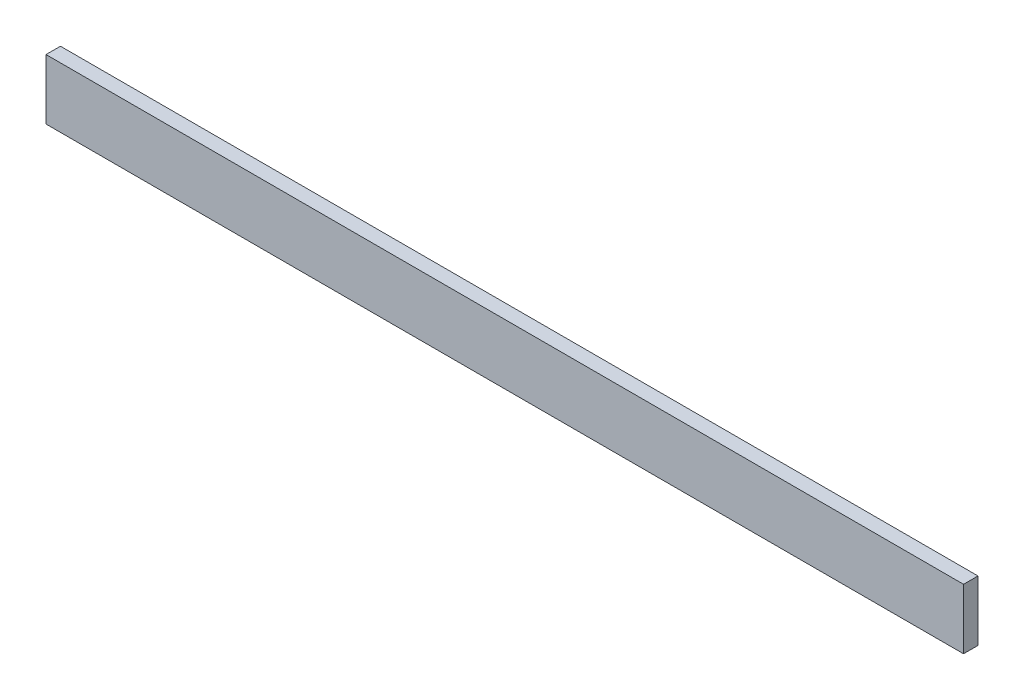
ISO-10303-21;
HEADER;
FILE_DESCRIPTION(('STEP AP214'),'2;1');
FILE_NAME('part.step','',(''),(''),'','','');
FILE_SCHEMA(('AUTOMOTIVE_DESIGN { 1 0 10303 214 1 1 1 1 }'));
ENDSEC;
DATA;
#1=APPLICATION_CONTEXT('core data for automotive mechanical design processes');
#2=APPLICATION_PROTOCOL_DEFINITION('international standard','automotive_design',2000,#1);
#3=PRODUCT_CONTEXT('',#1,'mechanical');
#4=PRODUCT('Part','Part','',(#3));
#5=PRODUCT_RELATED_PRODUCT_CATEGORY('part','',(#4));
#6=PRODUCT_DEFINITION_FORMATION('','',#4);
#7=PRODUCT_DEFINITION_CONTEXT('part definition',#1,'design');
#8=PRODUCT_DEFINITION('design','',#6,#7);
#9=PRODUCT_DEFINITION_SHAPE('','',#8);
#10=(LENGTH_UNIT() NAMED_UNIT(*) SI_UNIT(.MILLI.,.METRE.));
#11=(NAMED_UNIT(*) PLANE_ANGLE_UNIT() SI_UNIT($,.RADIAN.));
#12=(NAMED_UNIT(*) SI_UNIT($,.STERADIAN.) SOLID_ANGLE_UNIT());
#13=UNCERTAINTY_MEASURE_WITH_UNIT(LENGTH_MEASURE(1.E-05),#10,'distance_accuracy_value','');
#14=(GEOMETRIC_REPRESENTATION_CONTEXT(3) GLOBAL_UNCERTAINTY_ASSIGNED_CONTEXT((#13)) GLOBAL_UNIT_ASSIGNED_CONTEXT((#10,
#11,#12)) REPRESENTATION_CONTEXT('',''));
#15=CARTESIAN_POINT('',(0.,0.,0.));
#16=DIRECTION('',(0.,0.,1.));
#17=DIRECTION('',(1.,0.,0.));
#18=AXIS2_PLACEMENT_3D('',#15,#16,#17);
#19=CARTESIAN_POINT('',(-76.2,-5.00000000000001,2.4));
#20=DIRECTION('',(1.,0.,0.));
#21=DIRECTION('',(0.,0.,-1.));
#22=AXIS2_PLACEMENT_3D('',#19,#20,#21);
#23=PLANE('',#22);
#24=DIRECTION('',(0.,-1.,0.));
#25=VECTOR('',#24,1.);
#26=CARTESIAN_POINT('',(-76.2,-5.00000000000001,0.));
#27=LINE('',#26,#25);
#28=CARTESIAN_POINT('',(-76.2,4.99999999999999,0.));
#29=VERTEX_POINT('',#28);
#30=CARTESIAN_POINT('',(-76.2,-5.00000000000001,0.));
#31=VERTEX_POINT('',#30);
#32=EDGE_CURVE('E102',#29,#31,#27,.T.);
#33=ORIENTED_EDGE('',*,*,#32,.T.);
#34=DIRECTION('',(0.,0.,-1.));
#35=VECTOR('',#34,1.);
#36=CARTESIAN_POINT('',(-76.2,-5.00000000000001,2.4));
#37=LINE('',#36,#35);
#38=CARTESIAN_POINT('',(-76.2,-5.00000000000001,2.4));
#39=VERTEX_POINT('',#38);
#40=EDGE_CURVE('E11',#39,#31,#37,.T.);
#41=ORIENTED_EDGE('',*,*,#40,.F.);
#42=DIRECTION('',(0.,-1.,0.));
#43=VECTOR('',#42,1.);
#44=CARTESIAN_POINT('',(-76.2,-5.00000000000001,2.4));
#45=LINE('',#44,#43);
#46=CARTESIAN_POINT('',(-76.2,4.99999999999999,2.4));
#47=VERTEX_POINT('',#46);
#48=EDGE_CURVE('E90',#47,#39,#45,.T.);
#49=ORIENTED_EDGE('',*,*,#48,.F.);
#50=DIRECTION('',(0.,0.,-1.));
#51=VECTOR('',#50,1.);
#52=CARTESIAN_POINT('',(-76.2,4.99999999999999,2.4));
#53=LINE('',#52,#51);
#54=EDGE_CURVE('E98',#47,#29,#53,.T.);
#55=ORIENTED_EDGE('',*,*,#54,.T.);
#56=EDGE_LOOP('',(#33,#41,#49,#55));
#57=FACE_BOUND('',#56,.T.);
#58=ADVANCED_FACE('F39',(#57),#23,.F.);
#59=CARTESIAN_POINT('',(76.2,-4.99999999999999,2.4));
#60=DIRECTION('',(0.,1.,0.));
#61=DIRECTION('',(-1.,0.,0.));
#62=AXIS2_PLACEMENT_3D('',#59,#60,#61);
#63=PLANE('',#62);
#64=DIRECTION('',(1.,0.,0.));
#65=VECTOR('',#64,1.);
#66=CARTESIAN_POINT('',(76.2,-4.99999999999999,0.));
#67=LINE('',#66,#65);
#68=CARTESIAN_POINT('',(76.2,-4.99999999999999,0.));
#69=VERTEX_POINT('',#68);
#70=EDGE_CURVE('E94',#31,#69,#67,.T.);
#71=ORIENTED_EDGE('',*,*,#70,.T.);
#72=DIRECTION('',(0.,0.,-1.));
#73=VECTOR('',#72,1.);
#74=CARTESIAN_POINT('',(76.2,-4.99999999999999,2.4));
#75=LINE('',#74,#73);
#76=CARTESIAN_POINT('',(76.2,-4.99999999999999,2.4));
#77=VERTEX_POINT('',#76);
#78=EDGE_CURVE('E47',#77,#69,#75,.T.);
#79=ORIENTED_EDGE('',*,*,#78,.F.);
#80=DIRECTION('',(1.,0.,0.));
#81=VECTOR('',#80,1.);
#82=CARTESIAN_POINT('',(76.2,-4.99999999999999,2.4));
#83=LINE('',#82,#81);
#84=EDGE_CURVE('E85',#39,#77,#83,.T.);
#85=ORIENTED_EDGE('',*,*,#84,.F.);
#86=ORIENTED_EDGE('',*,*,#40,.T.);
#87=EDGE_LOOP('',(#71,#79,#85,#86));
#88=FACE_BOUND('',#87,.T.);
#89=ADVANCED_FACE('F93',(#88),#63,.F.);
#90=CARTESIAN_POINT('',(76.2,-4.99999999999999,2.4));
#91=DIRECTION('',(-1.,0.,0.));
#92=DIRECTION('',(0.,0.,1.));
#93=AXIS2_PLACEMENT_3D('',#90,#91,#92);
#94=PLANE('',#93);
#95=DIRECTION('',(0.,1.,0.));
#96=VECTOR('',#95,1.);
#97=CARTESIAN_POINT('',(76.2,-4.99999999999999,0.));
#98=LINE('',#97,#96);
#99=CARTESIAN_POINT('',(76.2,5.00000000000001,0.));
#100=VERTEX_POINT('',#99);
#101=EDGE_CURVE('E72',#69,#100,#98,.T.);
#102=ORIENTED_EDGE('',*,*,#101,.T.);
#103=DIRECTION('',(0.,0.,-1.));
#104=VECTOR('',#103,1.);
#105=CARTESIAN_POINT('',(76.2,5.00000000000001,2.4));
#106=LINE('',#105,#104);
#107=CARTESIAN_POINT('',(76.2,5.00000000000001,2.4));
#108=VERTEX_POINT('',#107);
#109=EDGE_CURVE('E95',#108,#100,#106,.T.);
#110=ORIENTED_EDGE('',*,*,#109,.F.);
#111=DIRECTION('',(0.,1.,0.));
#112=VECTOR('',#111,1.);
#113=CARTESIAN_POINT('',(76.2,-4.99999999999999,2.4));
#114=LINE('',#113,#112);
#115=EDGE_CURVE('E88',#77,#108,#114,.T.);
#116=ORIENTED_EDGE('',*,*,#115,.F.);
#117=ORIENTED_EDGE('',*,*,#78,.T.);
#118=EDGE_LOOP('',(#102,#110,#116,#117));
#119=FACE_BOUND('',#118,.T.);
#120=ADVANCED_FACE('F96',(#119),#94,.F.);
#121=CARTESIAN_POINT('',(76.2,5.00000000000001,2.4));
#122=DIRECTION('',(0.,-1.,0.));
#123=DIRECTION('',(1.,0.,0.));
#124=AXIS2_PLACEMENT_3D('',#121,#122,#123);
#125=PLANE('',#124);
#126=DIRECTION('',(-1.,0.,0.));
#127=VECTOR('',#126,1.);
#128=CARTESIAN_POINT('',(76.2,5.00000000000001,0.));
#129=LINE('',#128,#127);
#130=EDGE_CURVE('E78',#100,#29,#129,.T.);
#131=ORIENTED_EDGE('',*,*,#130,.T.);
#132=ORIENTED_EDGE('',*,*,#54,.F.);
#133=DIRECTION('',(-1.,0.,0.));
#134=VECTOR('',#133,1.);
#135=CARTESIAN_POINT('',(76.2,5.00000000000001,2.4));
#136=LINE('',#135,#134);
#137=EDGE_CURVE('E55',#108,#47,#136,.T.);
#138=ORIENTED_EDGE('',*,*,#137,.F.);
#139=ORIENTED_EDGE('',*,*,#109,.T.);
#140=EDGE_LOOP('',(#131,#132,#138,#139));
#141=FACE_BOUND('',#140,.T.);
#142=ADVANCED_FACE('F109',(#141),#125,.F.);
#143=CARTESIAN_POINT('',(0.,0.,2.4));
#144=DIRECTION('',(0.,0.,1.));
#145=DIRECTION('',(1.,0.,0.));
#146=AXIS2_PLACEMENT_3D('',#143,#144,#145);
#147=PLANE('',#146);
#148=ORIENTED_EDGE('',*,*,#48,.T.);
#149=ORIENTED_EDGE('',*,*,#84,.T.);
#150=ORIENTED_EDGE('',*,*,#115,.T.);
#151=ORIENTED_EDGE('',*,*,#137,.T.);
#152=EDGE_LOOP('',(#148,#149,#150,#151));
#153=FACE_BOUND('',#152,.T.);
#154=ADVANCED_FACE('F86',(#153),#147,.T.);
#155=CARTESIAN_POINT('',(0.,0.,0.));
#156=DIRECTION('',(0.,0.,1.));
#157=DIRECTION('',(1.,0.,0.));
#158=AXIS2_PLACEMENT_3D('',#155,#156,#157);
#159=PLANE('',#158);
#160=ORIENTED_EDGE('',*,*,#32,.F.);
#161=ORIENTED_EDGE('',*,*,#130,.F.);
#162=ORIENTED_EDGE('',*,*,#101,.F.);
#163=ORIENTED_EDGE('',*,*,#70,.F.);
#164=EDGE_LOOP('',(#160,#161,#162,#163));
#165=FACE_BOUND('',#164,.T.);
#166=ADVANCED_FACE('F112',(#165),#159,.F.);
#167=CLOSED_SHELL('',(#58,#89,#120,#142,#154,#166));
#168=MANIFOLD_SOLID_BREP('B2',#167);
#169=ADVANCED_BREP_SHAPE_REPRESENTATION('',(#18,#168),#14);
#170=SHAPE_DEFINITION_REPRESENTATION(#9,#169);
ENDSEC;
END-ISO-10303-21;
